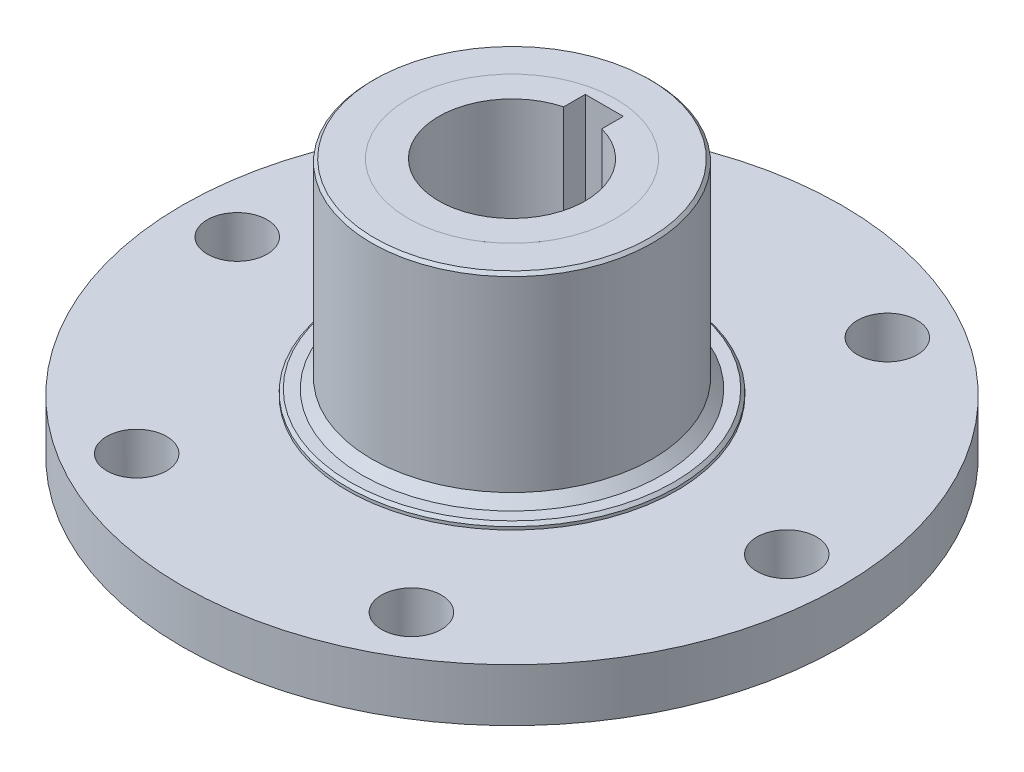
ISO-10303-21;
HEADER;
FILE_DESCRIPTION(('STEP AP214'),'2;1');
FILE_NAME('part.step','',(''),(''),'','','');
FILE_SCHEMA(('AUTOMOTIVE_DESIGN { 1 0 10303 214 1 1 1 1 }'));
ENDSEC;
DATA;
#1=APPLICATION_CONTEXT('core data for automotive mechanical design processes');
#2=APPLICATION_PROTOCOL_DEFINITION('international standard','automotive_design',2000,#1);
#3=PRODUCT_CONTEXT('',#1,'mechanical');
#4=PRODUCT('Part','Part','',(#3));
#5=PRODUCT_RELATED_PRODUCT_CATEGORY('part','',(#4));
#6=PRODUCT_DEFINITION_FORMATION('','',#4);
#7=PRODUCT_DEFINITION_CONTEXT('part definition',#1,'design');
#8=PRODUCT_DEFINITION('design','',#6,#7);
#9=PRODUCT_DEFINITION_SHAPE('','',#8);
#10=(LENGTH_UNIT() NAMED_UNIT(*) SI_UNIT(.MILLI.,.METRE.));
#11=(NAMED_UNIT(*) PLANE_ANGLE_UNIT() SI_UNIT($,.RADIAN.));
#12=(NAMED_UNIT(*) SI_UNIT($,.STERADIAN.) SOLID_ANGLE_UNIT());
#13=UNCERTAINTY_MEASURE_WITH_UNIT(LENGTH_MEASURE(1.E-05),#10,'distance_accuracy_value','');
#14=(GEOMETRIC_REPRESENTATION_CONTEXT(3) GLOBAL_UNCERTAINTY_ASSIGNED_CONTEXT((#13)) GLOBAL_UNIT_ASSIGNED_CONTEXT((#10,
#11,#12)) REPRESENTATION_CONTEXT('',''));
#15=CARTESIAN_POINT('',(0.,0.,0.));
#16=DIRECTION('',(0.,0.,1.));
#17=DIRECTION('',(1.,0.,0.));
#18=AXIS2_PLACEMENT_3D('',#15,#16,#17);
#19=CARTESIAN_POINT('',(0.,0.,0.));
#20=DIRECTION('',(0.,1.,0.));
#21=DIRECTION('',(0.,0.,1.));
#22=AXIS2_PLACEMENT_3D('',#19,#20,#21);
#23=PLANE('',#22);
#24=CARTESIAN_POINT('',(0.,0.,0.));
#25=DIRECTION('',(0.,1.,0.));
#26=DIRECTION('',(0.,0.,1.));
#27=AXIS2_PLACEMENT_3D('',#24,#25,#26);
#28=CIRCLE('',#27,8.98423544024529);
#29=CARTESIAN_POINT('',(0.,0.,8.98423544024529));
#30=VERTEX_POINT('',#29);
#31=EDGE_CURVE('E159',#30,#30,#28,.T.);
#32=ORIENTED_EDGE('',*,*,#31,.F.);
#33=EDGE_LOOP('',(#32));
#34=FACE_BOUND('',#33,.T.);
#35=DIRECTION('',(-1.,0.,0.));
#36=VECTOR('',#35,1.);
#37=CARTESIAN_POINT('',(1.651,0.,-8.001));
#38=LINE('',#37,#36);
#39=CARTESIAN_POINT('',(1.651,0.,-8.001));
#40=VERTEX_POINT('',#39);
#41=CARTESIAN_POINT('',(-1.651,0.,-8.001));
#42=VERTEX_POINT('',#41);
#43=EDGE_CURVE('E91',#40,#42,#38,.T.);
#44=ORIENTED_EDGE('',*,*,#43,.T.);
#45=DIRECTION('',(0.,0.,1.));
#46=VECTOR('',#45,1.);
#47=CARTESIAN_POINT('',(-1.651,0.,-8.001));
#48=LINE('',#47,#46);
#49=CARTESIAN_POINT('',(-1.651,0.,-6.13161471392324));
#50=VERTEX_POINT('',#49);
#51=EDGE_CURVE('E94',#42,#50,#48,.T.);
#52=ORIENTED_EDGE('',*,*,#51,.T.);
#53=CARTESIAN_POINT('',(0.,0.,0.));
#54=DIRECTION('',(0.,-1.,0.));
#55=DIRECTION('',(0.,0.,-1.));
#56=AXIS2_PLACEMENT_3D('',#53,#54,#55);
#57=CIRCLE('',#56,6.35);
#58=CARTESIAN_POINT('',(1.651,0.,-6.13161471392324));
#59=VERTEX_POINT('',#58);
#60=EDGE_CURVE('E96',#59,#50,#57,.T.);
#61=ORIENTED_EDGE('',*,*,#60,.F.);
#62=DIRECTION('',(0.,0.,-1.));
#63=VECTOR('',#62,1.);
#64=CARTESIAN_POINT('',(1.651,0.,-6.13161471392324));
#65=LINE('',#64,#63);
#66=EDGE_CURVE('E83',#59,#40,#65,.T.);
#67=ORIENTED_EDGE('',*,*,#66,.T.);
#68=EDGE_LOOP('',(#44,#52,#61,#67));
#69=FACE_BOUND('',#68,.T.);
#70=ADVANCED_FACE('F36',(#34,#69),#23,.F.);
#71=CARTESIAN_POINT('',(0.,0.254000000000011,0.));
#72=DIRECTION('',(0.,1.,0.));
#73=DIRECTION('',(0.,0.,1.));
#74=AXIS2_PLACEMENT_3D('',#71,#72,#73);
#75=CONICAL_SURFACE('',#74,9.2382354402453,0.785398163397459);
#76=CARTESIAN_POINT('',(0.,0.254000000000011,0.));
#77=DIRECTION('',(0.,1.,0.));
#78=DIRECTION('',(0.,0.,1.));
#79=AXIS2_PLACEMENT_3D('',#76,#77,#78);
#80=CIRCLE('',#79,9.2382354402453);
#81=CARTESIAN_POINT('',(0.,0.254000000000011,9.2382354402453));
#82=VERTEX_POINT('',#81);
#83=EDGE_CURVE('E155',#82,#82,#80,.T.);
#84=ORIENTED_EDGE('',*,*,#83,.F.);
#85=EDGE_LOOP('',(#84));
#86=FACE_BOUND('',#85,.T.);
#87=ORIENTED_EDGE('',*,*,#31,.T.);
#88=EDGE_LOOP('',(#87));
#89=FACE_BOUND('',#88,.T.);
#90=ADVANCED_FACE('F305',(#86,#89),#75,.T.);
#91=CARTESIAN_POINT('',(0.,-26.1296757039814,0.));
#92=DIRECTION('',(0.,1.,0.));
#93=DIRECTION('',(0.,0.,1.));
#94=AXIS2_PLACEMENT_3D('',#91,#92,#93);
#95=CYLINDRICAL_SURFACE('',#94,9.2382354402453);
#96=CARTESIAN_POINT('',(0.,1.524,0.));
#97=DIRECTION('',(0.,1.,0.));
#98=DIRECTION('',(0.,0.,1.));
#99=AXIS2_PLACEMENT_3D('',#96,#97,#98);
#100=CIRCLE('',#99,9.2382354402453);
#101=CARTESIAN_POINT('',(0.,1.524,9.2382354402453));
#102=VERTEX_POINT('',#101);
#103=EDGE_CURVE('E154',#102,#102,#100,.T.);
#104=ORIENTED_EDGE('',*,*,#103,.F.);
#105=EDGE_LOOP('',(#104));
#106=FACE_BOUND('',#105,.T.);
#107=ORIENTED_EDGE('',*,*,#83,.T.);
#108=EDGE_LOOP('',(#107));
#109=FACE_BOUND('',#108,.T.);
#110=ADVANCED_FACE('F298',(#106,#109),#95,.T.);
#111=CARTESIAN_POINT('',(-8.89,1.524,0.));
#112=DIRECTION('',(0.,-1.,0.));
#113=DIRECTION('',(0.,0.,-1.));
#114=AXIS2_PLACEMENT_3D('',#111,#112,#113);
#115=PLANE('',#114);
#116=CARTESIAN_POINT('',(0.,1.524,0.));
#117=DIRECTION('',(0.,1.,0.));
#118=DIRECTION('',(0.,0.,1.));
#119=AXIS2_PLACEMENT_3D('',#116,#117,#118);
#120=CIRCLE('',#119,14.0208);
#121=CARTESIAN_POINT('',(0.,1.524,14.0208));
#122=VERTEX_POINT('',#121);
#123=EDGE_CURVE('E150',#122,#122,#120,.T.);
#124=ORIENTED_EDGE('',*,*,#123,.F.);
#125=EDGE_LOOP('',(#124));
#126=FACE_BOUND('',#125,.T.);
#127=ORIENTED_EDGE('',*,*,#103,.T.);
#128=EDGE_LOOP('',(#127));
#129=FACE_BOUND('',#128,.T.);
#130=ADVANCED_FACE('F290',(#126,#129),#115,.T.);
#131=CARTESIAN_POINT('',(0.,1.77800000000001,0.));
#132=DIRECTION('',(0.,1.,0.));
#133=DIRECTION('',(0.,0.,1.));
#134=AXIS2_PLACEMENT_3D('',#131,#132,#133);
#135=CONICAL_SURFACE('',#134,14.2748,0.785398163397456);
#136=ORIENTED_EDGE('',*,*,#123,.T.);
#137=EDGE_LOOP('',(#136));
#138=FACE_BOUND('',#137,.T.);
#139=CARTESIAN_POINT('',(0.,1.77800000000001,0.));
#140=DIRECTION('',(0.,-1.,0.));
#141=DIRECTION('',(0.,0.,-1.));
#142=AXIS2_PLACEMENT_3D('',#139,#140,#141);
#143=CIRCLE('',#142,14.2748);
#144=CARTESIAN_POINT('',(0.,1.77800000000001,-14.2748));
#145=VERTEX_POINT('',#144);
#146=EDGE_CURVE('E143',#145,#145,#143,.F.);
#147=ORIENTED_EDGE('',*,*,#146,.F.);
#148=EDGE_LOOP('',(#147));
#149=FACE_BOUND('',#148,.T.);
#150=ADVANCED_FACE('F236',(#138,#149),#135,.T.);
#151=CARTESIAN_POINT('',(0.,-1.0757851457721,0.));
#152=DIRECTION('',(0.,-1.,0.));
#153=DIRECTION('',(0.,0.,-1.));
#154=AXIS2_PLACEMENT_3D('',#151,#152,#153);
#155=CYLINDRICAL_SURFACE('',#154,14.2748);
#156=CARTESIAN_POINT('',(0.,3.048,0.));
#157=DIRECTION('',(0.,-1.,0.));
#158=DIRECTION('',(0.,0.,-1.));
#159=AXIS2_PLACEMENT_3D('',#156,#157,#158);
#160=CIRCLE('',#159,14.2748);
#161=CARTESIAN_POINT('',(0.,3.048,-14.2748));
#162=VERTEX_POINT('',#161);
#163=EDGE_CURVE('E180',#162,#162,#160,.F.);
#164=ORIENTED_EDGE('',*,*,#163,.F.);
#165=EDGE_LOOP('',(#164));
#166=FACE_BOUND('',#165,.T.);
#167=ORIENTED_EDGE('',*,*,#146,.T.);
#168=EDGE_LOOP('',(#167));
#169=FACE_BOUND('',#168,.T.);
#170=ADVANCED_FACE('F226',(#166,#169),#155,.T.);
#171=CARTESIAN_POINT('',(-38.1,3.048,0.));
#172=DIRECTION('',(0.,-1.,0.));
#173=DIRECTION('',(0.,0.,-1.));
#174=AXIS2_PLACEMENT_3D('',#171,#172,#173);
#175=PLANE('',#174);
#176=CARTESIAN_POINT('',(-11.9062499999998,3.048,20.6222299276171));
#177=DIRECTION('',(0.,1.,0.));
#178=DIRECTION('',(0.,0.,1.));
#179=AXIS2_PLACEMENT_3D('',#176,#177,#178);
#180=CIRCLE('',#179,2.5908);
#181=CARTESIAN_POINT('',(-11.9062499999998,3.048,23.2130299276171));
#182=VERTEX_POINT('',#181);
#183=EDGE_CURVE('E174',#182,#182,#180,.T.);
#184=ORIENTED_EDGE('',*,*,#183,.T.);
#185=EDGE_LOOP('',(#184));
#186=FACE_BOUND('',#185,.T.);
#187=CARTESIAN_POINT('',(11.9062500000002,3.048,20.6222299276168));
#188=DIRECTION('',(0.,1.,0.));
#189=DIRECTION('',(0.,0.,1.));
#190=AXIS2_PLACEMENT_3D('',#187,#188,#189);
#191=CIRCLE('',#190,2.5908);
#192=CARTESIAN_POINT('',(11.9062500000002,3.048,23.2130299276168));
#193=VERTEX_POINT('',#192);
#194=EDGE_CURVE('E171',#193,#193,#191,.T.);
#195=ORIENTED_EDGE('',*,*,#194,.T.);
#196=EDGE_LOOP('',(#195));
#197=FACE_BOUND('',#196,.T.);
#198=CARTESIAN_POINT('',(23.8125,3.048,0.));
#199=DIRECTION('',(0.,1.,0.));
#200=DIRECTION('',(0.,0.,1.));
#201=AXIS2_PLACEMENT_3D('',#198,#199,#200);
#202=CIRCLE('',#201,2.5908);
#203=CARTESIAN_POINT('',(23.8125,3.048,2.5908));
#204=VERTEX_POINT('',#203);
#205=EDGE_CURVE('E168',#204,#204,#202,.T.);
#206=ORIENTED_EDGE('',*,*,#205,.T.);
#207=EDGE_LOOP('',(#206));
#208=FACE_BOUND('',#207,.T.);
#209=CARTESIAN_POINT('',(11.90625,3.048,-20.622229927617));
#210=DIRECTION('',(0.,1.,0.));
#211=DIRECTION('',(0.,0.,1.));
#212=AXIS2_PLACEMENT_3D('',#209,#210,#211);
#213=CIRCLE('',#212,2.5908);
#214=CARTESIAN_POINT('',(11.90625,3.048,-18.031429927617));
#215=VERTEX_POINT('',#214);
#216=EDGE_CURVE('E165',#215,#215,#213,.T.);
#217=ORIENTED_EDGE('',*,*,#216,.T.);
#218=EDGE_LOOP('',(#217));
#219=FACE_BOUND('',#218,.T.);
#220=CARTESIAN_POINT('',(-11.9062500000001,3.048,-20.6222299276169));
#221=DIRECTION('',(0.,1.,0.));
#222=DIRECTION('',(0.,0.,1.));
#223=AXIS2_PLACEMENT_3D('',#220,#221,#222);
#224=CIRCLE('',#223,2.5908);
#225=CARTESIAN_POINT('',(-11.9062500000001,3.048,-18.0314299276169));
#226=VERTEX_POINT('',#225);
#227=EDGE_CURVE('E162',#226,#226,#224,.T.);
#228=ORIENTED_EDGE('',*,*,#227,.T.);
#229=EDGE_LOOP('',(#228));
#230=FACE_BOUND('',#229,.T.);
#231=CARTESIAN_POINT('',(-23.8125,3.048,0.));
#232=DIRECTION('',(0.,1.,0.));
#233=DIRECTION('',(0.,0.,1.));
#234=AXIS2_PLACEMENT_3D('',#231,#232,#233);
#235=CIRCLE('',#234,2.5908);
#236=CARTESIAN_POINT('',(-23.8125,3.048,2.5908));
#237=VERTEX_POINT('',#236);
#238=EDGE_CURVE('E142',#237,#237,#235,.T.);
#239=ORIENTED_EDGE('',*,*,#238,.T.);
#240=EDGE_LOOP('',(#239));
#241=FACE_BOUND('',#240,.T.);
#242=ORIENTED_EDGE('',*,*,#163,.T.);
#243=EDGE_LOOP('',(#242));
#244=FACE_BOUND('',#243,.T.);
#245=CARTESIAN_POINT('',(0.,3.048,0.));
#246=DIRECTION('',(0.,-1.,0.));
#247=DIRECTION('',(0.,0.,-1.));
#248=AXIS2_PLACEMENT_3D('',#245,#246,#247);
#249=CIRCLE('',#248,28.575);
#250=CARTESIAN_POINT('',(0.,3.048,-28.575));
#251=VERTEX_POINT('',#250);
#252=EDGE_CURVE('E133',#251,#251,#249,.T.);
#253=ORIENTED_EDGE('',*,*,#252,.T.);
#254=EDGE_LOOP('',(#253));
#255=FACE_BOUND('',#254,.T.);
#256=ADVANCED_FACE('F223',(#186,#197,#208,#219,#230,#241,#244,#255),#175,.T.);
#257=CARTESIAN_POINT('',(-11.9062499999998,0.,20.6222299276171));
#258=DIRECTION('',(0.,1.,0.));
#259=DIRECTION('',(0.,0.,1.));
#260=AXIS2_PLACEMENT_3D('',#257,#258,#259);
#261=CYLINDRICAL_SURFACE('',#260,2.5908);
#262=ORIENTED_EDGE('',*,*,#183,.F.);
#263=EDGE_LOOP('',(#262));
#264=FACE_BOUND('',#263,.T.);
#265=CARTESIAN_POINT('',(-11.9062499999998,7.62,20.6222299276171));
#266=DIRECTION('',(0.,-1.,0.));
#267=DIRECTION('',(0.,0.,-1.));
#268=AXIS2_PLACEMENT_3D('',#265,#266,#267);
#269=CIRCLE('',#268,2.5908);
#270=CARTESIAN_POINT('',(-11.9062499999998,7.62,18.0314299276171));
#271=VERTEX_POINT('',#270);
#272=EDGE_CURVE('E130',#271,#271,#269,.T.);
#273=ORIENTED_EDGE('',*,*,#272,.F.);
#274=EDGE_LOOP('',(#273));
#275=FACE_BOUND('',#274,.T.);
#276=ADVANCED_FACE('F225',(#264,#275),#261,.F.);
#277=CARTESIAN_POINT('',(11.9062500000002,0.,20.6222299276168));
#278=DIRECTION('',(0.,1.,0.));
#279=DIRECTION('',(0.,0.,1.));
#280=AXIS2_PLACEMENT_3D('',#277,#278,#279);
#281=CYLINDRICAL_SURFACE('',#280,2.5908);
#282=ORIENTED_EDGE('',*,*,#194,.F.);
#283=EDGE_LOOP('',(#282));
#284=FACE_BOUND('',#283,.T.);
#285=CARTESIAN_POINT('',(11.9062500000002,7.62,20.6222299276168));
#286=DIRECTION('',(0.,-1.,0.));
#287=DIRECTION('',(0.,0.,-1.));
#288=AXIS2_PLACEMENT_3D('',#285,#286,#287);
#289=CIRCLE('',#288,2.5908);
#290=CARTESIAN_POINT('',(11.9062500000002,7.62,18.0314299276168));
#291=VERTEX_POINT('',#290);
#292=EDGE_CURVE('E127',#291,#291,#289,.T.);
#293=ORIENTED_EDGE('',*,*,#292,.F.);
#294=EDGE_LOOP('',(#293));
#295=FACE_BOUND('',#294,.T.);
#296=ADVANCED_FACE('F233',(#284,#295),#281,.F.);
#297=CARTESIAN_POINT('',(23.8125,0.,0.));
#298=DIRECTION('',(0.,1.,0.));
#299=DIRECTION('',(0.,0.,1.));
#300=AXIS2_PLACEMENT_3D('',#297,#298,#299);
#301=CYLINDRICAL_SURFACE('',#300,2.5908);
#302=ORIENTED_EDGE('',*,*,#205,.F.);
#303=EDGE_LOOP('',(#302));
#304=FACE_BOUND('',#303,.T.);
#305=CARTESIAN_POINT('',(23.8125,7.62,0.));
#306=DIRECTION('',(0.,-1.,0.));
#307=DIRECTION('',(0.,0.,-1.));
#308=AXIS2_PLACEMENT_3D('',#305,#306,#307);
#309=CIRCLE('',#308,2.5908);
#310=CARTESIAN_POINT('',(23.8125,7.62,-2.5908));
#311=VERTEX_POINT('',#310);
#312=EDGE_CURVE('E124',#311,#311,#309,.T.);
#313=ORIENTED_EDGE('',*,*,#312,.F.);
#314=EDGE_LOOP('',(#313));
#315=FACE_BOUND('',#314,.T.);
#316=ADVANCED_FACE('F258',(#304,#315),#301,.F.);
#317=CARTESIAN_POINT('',(11.90625,0.,-20.622229927617));
#318=DIRECTION('',(0.,1.,0.));
#319=DIRECTION('',(0.,0.,1.));
#320=AXIS2_PLACEMENT_3D('',#317,#318,#319);
#321=CYLINDRICAL_SURFACE('',#320,2.5908);
#322=ORIENTED_EDGE('',*,*,#216,.F.);
#323=EDGE_LOOP('',(#322));
#324=FACE_BOUND('',#323,.T.);
#325=CARTESIAN_POINT('',(11.90625,7.62,-20.622229927617));
#326=DIRECTION('',(0.,-1.,0.));
#327=DIRECTION('',(0.,0.,-1.));
#328=AXIS2_PLACEMENT_3D('',#325,#326,#327);
#329=CIRCLE('',#328,2.5908);
#330=CARTESIAN_POINT('',(11.90625,7.62,-23.213029927617));
#331=VERTEX_POINT('',#330);
#332=EDGE_CURVE('E121',#331,#331,#329,.T.);
#333=ORIENTED_EDGE('',*,*,#332,.F.);
#334=EDGE_LOOP('',(#333));
#335=FACE_BOUND('',#334,.T.);
#336=ADVANCED_FACE('F249',(#324,#335),#321,.F.);
#337=CARTESIAN_POINT('',(-11.9062500000001,0.,-20.6222299276169));
#338=DIRECTION('',(0.,1.,0.));
#339=DIRECTION('',(0.,0.,1.));
#340=AXIS2_PLACEMENT_3D('',#337,#338,#339);
#341=CYLINDRICAL_SURFACE('',#340,2.5908);
#342=ORIENTED_EDGE('',*,*,#227,.F.);
#343=EDGE_LOOP('',(#342));
#344=FACE_BOUND('',#343,.T.);
#345=CARTESIAN_POINT('',(-11.90625,7.62,-20.622229927617));
#346=DIRECTION('',(0.,-1.,0.));
#347=DIRECTION('',(0.,0.,-1.));
#348=AXIS2_PLACEMENT_3D('',#345,#346,#347);
#349=CIRCLE('',#348,2.59079999999991);
#350=CARTESIAN_POINT('',(-11.90625,7.62,-23.2130299276169));
#351=VERTEX_POINT('',#350);
#352=EDGE_CURVE('E118',#351,#351,#349,.T.);
#353=ORIENTED_EDGE('',*,*,#352,.F.);
#354=EDGE_LOOP('',(#353));
#355=FACE_BOUND('',#354,.T.);
#356=ADVANCED_FACE('F243',(#344,#355),#341,.F.);
#357=CARTESIAN_POINT('',(-23.8125,0.,0.));
#358=DIRECTION('',(0.,1.,0.));
#359=DIRECTION('',(0.,0.,1.));
#360=AXIS2_PLACEMENT_3D('',#357,#358,#359);
#361=CYLINDRICAL_SURFACE('',#360,2.5908);
#362=ORIENTED_EDGE('',*,*,#238,.F.);
#363=EDGE_LOOP('',(#362));
#364=FACE_BOUND('',#363,.T.);
#365=CARTESIAN_POINT('',(-23.8125,7.62,0.));
#366=DIRECTION('',(0.,-1.,0.));
#367=DIRECTION('',(0.,0.,-1.));
#368=AXIS2_PLACEMENT_3D('',#365,#366,#367);
#369=CIRCLE('',#368,2.59080000000001);
#370=CARTESIAN_POINT('',(-23.8125,7.62,-2.59080000000001));
#371=VERTEX_POINT('',#370);
#372=EDGE_CURVE('E115',#371,#371,#369,.T.);
#373=ORIENTED_EDGE('',*,*,#372,.F.);
#374=EDGE_LOOP('',(#373));
#375=FACE_BOUND('',#374,.T.);
#376=ADVANCED_FACE('F201',(#364,#375),#361,.F.);
#377=CARTESIAN_POINT('',(0.,7.62,0.));
#378=DIRECTION('',(0.,-1.,0.));
#379=DIRECTION('',(0.,0.,-1.));
#380=AXIS2_PLACEMENT_3D('',#377,#378,#379);
#381=PLANE('',#380);
#382=CARTESIAN_POINT('',(0.,7.62,0.));
#383=DIRECTION('',(0.,-1.,0.));
#384=DIRECTION('',(0.,0.,-1.));
#385=AXIS2_PLACEMENT_3D('',#382,#383,#384);
#386=CIRCLE('',#385,14.2748);
#387=CARTESIAN_POINT('',(0.,7.62,-14.2748));
#388=VERTEX_POINT('',#387);
#389=EDGE_CURVE('E137',#388,#388,#386,.F.);
#390=ORIENTED_EDGE('',*,*,#389,.F.);
#391=EDGE_LOOP('',(#390));
#392=FACE_BOUND('',#391,.T.);
#393=ORIENTED_EDGE('',*,*,#372,.T.);
#394=EDGE_LOOP('',(#393));
#395=FACE_BOUND('',#394,.T.);
#396=ORIENTED_EDGE('',*,*,#352,.T.);
#397=EDGE_LOOP('',(#396));
#398=FACE_BOUND('',#397,.T.);
#399=ORIENTED_EDGE('',*,*,#332,.T.);
#400=EDGE_LOOP('',(#399));
#401=FACE_BOUND('',#400,.T.);
#402=ORIENTED_EDGE('',*,*,#312,.T.);
#403=EDGE_LOOP('',(#402));
#404=FACE_BOUND('',#403,.T.);
#405=ORIENTED_EDGE('',*,*,#292,.T.);
#406=EDGE_LOOP('',(#405));
#407=FACE_BOUND('',#406,.T.);
#408=ORIENTED_EDGE('',*,*,#272,.T.);
#409=EDGE_LOOP('',(#408));
#410=FACE_BOUND('',#409,.T.);
#411=CARTESIAN_POINT('',(0.,7.62,0.));
#412=DIRECTION('',(0.,-1.,0.));
#413=DIRECTION('',(0.,0.,-1.));
#414=AXIS2_PLACEMENT_3D('',#411,#412,#413);
#415=CIRCLE('',#414,28.575);
#416=CARTESIAN_POINT('',(0.,7.62,-28.575));
#417=VERTEX_POINT('',#416);
#418=EDGE_CURVE('E134',#417,#417,#415,.T.);
#419=ORIENTED_EDGE('',*,*,#418,.F.);
#420=EDGE_LOOP('',(#419));
#421=FACE_BOUND('',#420,.T.);
#422=ADVANCED_FACE('F197',(#392,#395,#398,#401,#404,#407,#410,#421),#381,.F.);
#423=CARTESIAN_POINT('',(0.,7.62,0.));
#424=DIRECTION('',(0.,-1.,0.));
#425=DIRECTION('',(0.,0.,-1.));
#426=AXIS2_PLACEMENT_3D('',#423,#424,#425);
#427=CYLINDRICAL_SURFACE('',#426,28.575);
#428=ORIENTED_EDGE('',*,*,#418,.T.);
#429=EDGE_LOOP('',(#428));
#430=FACE_BOUND('',#429,.T.);
#431=ORIENTED_EDGE('',*,*,#252,.F.);
#432=EDGE_LOOP('',(#431));
#433=FACE_BOUND('',#432,.T.);
#434=ADVANCED_FACE('F200',(#430,#433),#427,.T.);
#435=CARTESIAN_POINT('',(0.,25.146,0.));
#436=DIRECTION('',(0.,-1.,0.));
#437=DIRECTION('',(1.,0.,0.));
#438=AXIS2_PLACEMENT_3D('',#435,#436,#437);
#439=CONICAL_SURFACE('',#438,12.1666,0.785398163397452);
#440=CARTESIAN_POINT('',(0.,25.4,0.));
#441=DIRECTION('',(0.,-1.,0.));
#442=DIRECTION('',(1.,0.,0.));
#443=AXIS2_PLACEMENT_3D('',#440,#441,#442);
#444=CIRCLE('',#443,11.9126);
#445=CARTESIAN_POINT('',(11.9126,25.4,0.));
#446=VERTEX_POINT('',#445);
#447=EDGE_CURVE('E158',#446,#446,#444,.T.);
#448=ORIENTED_EDGE('',*,*,#447,.T.);
#449=EDGE_LOOP('',(#448));
#450=FACE_BOUND('',#449,.T.);
#451=CARTESIAN_POINT('',(0.,25.146,0.));
#452=DIRECTION('',(0.,-1.,0.));
#453=DIRECTION('',(0.,0.,-1.));
#454=AXIS2_PLACEMENT_3D('',#451,#452,#453);
#455=CIRCLE('',#454,12.1666);
#456=CARTESIAN_POINT('',(0.,25.146,-12.1666));
#457=VERTEX_POINT('',#456);
#458=EDGE_CURVE('E151',#457,#457,#455,.T.);
#459=ORIENTED_EDGE('',*,*,#458,.F.);
#460=EDGE_LOOP('',(#459));
#461=FACE_BOUND('',#460,.T.);
#462=ADVANCED_FACE('F219',(#450,#461),#439,.T.);
#463=CARTESIAN_POINT('',(0.,25.4,0.));
#464=DIRECTION('',(0.,1.,0.));
#465=DIRECTION('',(0.,0.,1.));
#466=AXIS2_PLACEMENT_3D('',#463,#464,#465);
#467=PLANE('',#466);
#468=CARTESIAN_POINT('',(0.,25.4,0.));
#469=DIRECTION('',(0.,1.,0.));
#470=DIRECTION('',(0.,0.,1.));
#471=AXIS2_PLACEMENT_3D('',#468,#469,#470);
#472=CIRCLE('',#471,8.98423544024529);
#473=CARTESIAN_POINT('',(0.,25.4,8.98423544024529));
#474=VERTEX_POINT('',#473);
#475=EDGE_CURVE('E11',#474,#474,#472,.T.);
#476=ORIENTED_EDGE('',*,*,#475,.F.);
#477=EDGE_LOOP('',(#476));
#478=FACE_BOUND('',#477,.T.);
#479=ORIENTED_EDGE('',*,*,#447,.F.);
#480=EDGE_LOOP('',(#479));
#481=FACE_BOUND('',#480,.T.);
#482=ADVANCED_FACE('F294',(#478,#481),#467,.T.);
#483=CARTESIAN_POINT('',(0.,25.4,0.));
#484=DIRECTION('',(0.,-1.,0.));
#485=DIRECTION('',(0.,0.,-1.));
#486=AXIS2_PLACEMENT_3D('',#483,#484,#485);
#487=CYLINDRICAL_SURFACE('',#486,12.1666);
#488=ORIENTED_EDGE('',*,*,#458,.T.);
#489=EDGE_LOOP('',(#488));
#490=FACE_BOUND('',#489,.T.);
#491=CARTESIAN_POINT('',(0.,8.94079999999999,0.));
#492=DIRECTION('',(0.,-1.,0.));
#493=DIRECTION('',(0.,0.,-1.));
#494=AXIS2_PLACEMENT_3D('',#491,#492,#493);
#495=CIRCLE('',#494,12.1666);
#496=CARTESIAN_POINT('',(0.,8.94079999999999,-12.1666));
#497=VERTEX_POINT('',#496);
#498=EDGE_CURVE('E147',#497,#497,#495,.T.);
#499=ORIENTED_EDGE('',*,*,#498,.F.);
#500=EDGE_LOOP('',(#499));
#501=FACE_BOUND('',#500,.T.);
#502=ADVANCED_FACE('F284',(#490,#501),#487,.T.);
#503=CARTESIAN_POINT('',(0.,8.128,0.));
#504=DIRECTION('',(0.,-1.,0.));
#505=DIRECTION('',(0.,0.,-1.));
#506=AXIS2_PLACEMENT_3D('',#503,#504,#505);
#507=CONICAL_SURFACE('',#506,12.9794,0.785398163397449);
#508=ORIENTED_EDGE('',*,*,#498,.T.);
#509=EDGE_LOOP('',(#508));
#510=FACE_BOUND('',#509,.T.);
#511=CARTESIAN_POINT('',(0.,8.128,0.));
#512=DIRECTION('',(0.,-1.,0.));
#513=DIRECTION('',(0.,0.,-1.));
#514=AXIS2_PLACEMENT_3D('',#511,#512,#513);
#515=CIRCLE('',#514,12.9794);
#516=CARTESIAN_POINT('',(0.,8.128,-12.9794));
#517=VERTEX_POINT('',#516);
#518=EDGE_CURVE('E146',#517,#517,#515,.T.);
#519=ORIENTED_EDGE('',*,*,#518,.F.);
#520=EDGE_LOOP('',(#519));
#521=FACE_BOUND('',#520,.T.);
#522=ADVANCED_FACE('F275',(#510,#521),#507,.T.);
#523=CARTESIAN_POINT('',(0.,8.128,0.));
#524=DIRECTION('',(0.,1.,0.));
#525=DIRECTION('',(0.,0.,1.));
#526=AXIS2_PLACEMENT_3D('',#523,#524,#525);
#527=PLANE('',#526);
#528=ORIENTED_EDGE('',*,*,#518,.T.);
#529=EDGE_LOOP('',(#528));
#530=FACE_BOUND('',#529,.T.);
#531=CARTESIAN_POINT('',(0.,8.128,0.));
#532=DIRECTION('',(0.,-1.,0.));
#533=DIRECTION('',(1.,0.,0.));
#534=AXIS2_PLACEMENT_3D('',#531,#532,#533);
#535=CIRCLE('',#534,14.0208);
#536=CARTESIAN_POINT('',(14.0208,8.128,0.));
#537=VERTEX_POINT('',#536);
#538=EDGE_CURVE('E177',#537,#537,#535,.T.);
#539=ORIENTED_EDGE('',*,*,#538,.F.);
#540=EDGE_LOOP('',(#539));
#541=FACE_BOUND('',#540,.T.);
#542=ADVANCED_FACE('F267',(#530,#541),#527,.T.);
#543=CARTESIAN_POINT('',(0.,7.87399999999998,0.));
#544=DIRECTION('',(0.,-1.,0.));
#545=DIRECTION('',(1.,0.,0.));
#546=AXIS2_PLACEMENT_3D('',#543,#544,#545);
#547=CONICAL_SURFACE('',#546,14.2748,0.785398163397455);
#548=ORIENTED_EDGE('',*,*,#538,.T.);
#549=EDGE_LOOP('',(#548));
#550=FACE_BOUND('',#549,.T.);
#551=CARTESIAN_POINT('',(0.,7.87399999999998,0.));
#552=DIRECTION('',(0.,-1.,0.));
#553=DIRECTION('',(0.,0.,-1.));
#554=AXIS2_PLACEMENT_3D('',#551,#552,#553);
#555=CIRCLE('',#554,14.2748);
#556=CARTESIAN_POINT('',(0.,7.87399999999998,-14.2748));
#557=VERTEX_POINT('',#556);
#558=EDGE_CURVE('E44',#557,#557,#555,.T.);
#559=ORIENTED_EDGE('',*,*,#558,.F.);
#560=EDGE_LOOP('',(#559));
#561=FACE_BOUND('',#560,.T.);
#562=ADVANCED_FACE('F265',(#550,#561),#547,.T.);
#563=CARTESIAN_POINT('',(0.,-1.0757851457721,0.));
#564=DIRECTION('',(0.,-1.,0.));
#565=DIRECTION('',(0.,0.,-1.));
#566=AXIS2_PLACEMENT_3D('',#563,#564,#565);
#567=CYLINDRICAL_SURFACE('',#566,14.2748);
#568=ORIENTED_EDGE('',*,*,#558,.T.);
#569=EDGE_LOOP('',(#568));
#570=FACE_BOUND('',#569,.T.);
#571=ORIENTED_EDGE('',*,*,#389,.T.);
#572=EDGE_LOOP('',(#571));
#573=FACE_BOUND('',#572,.T.);
#574=ADVANCED_FACE('F195',(#570,#573),#567,.T.);
#575=CARTESIAN_POINT('',(0.,25.4001030776407,0.));
#576=DIRECTION('',(0.,-1.,0.));
#577=DIRECTION('',(0.,0.,-1.));
#578=AXIS2_PLACEMENT_3D('',#575,#576,#577);
#579=PLANE('',#578);
#580=CARTESIAN_POINT('',(0.,25.4001030776407,0.));
#581=DIRECTION('',(0.,-1.,0.));
#582=DIRECTION('',(0.,0.,-1.));
#583=AXIS2_PLACEMENT_3D('',#580,#581,#582);
#584=CIRCLE('',#583,6.35);
#585=CARTESIAN_POINT('',(1.651,25.4001030776407,-6.13161471392324));
#586=VERTEX_POINT('',#585);
#587=CARTESIAN_POINT('',(-1.651,25.4001030776407,-6.13161471392324));
#588=VERTEX_POINT('',#587);
#589=EDGE_CURVE('E108',#586,#588,#584,.T.);
#590=ORIENTED_EDGE('',*,*,#589,.T.);
#591=DIRECTION('',(0.,0.,1.));
#592=VECTOR('',#591,1.);
#593=CARTESIAN_POINT('',(-1.651,25.4001030776407,-8.001));
#594=LINE('',#593,#592);
#595=CARTESIAN_POINT('',(-1.651,25.4001030776407,-8.001));
#596=VERTEX_POINT('',#595);
#597=EDGE_CURVE('E97',#596,#588,#594,.T.);
#598=ORIENTED_EDGE('',*,*,#597,.F.);
#599=DIRECTION('',(-1.,0.,0.));
#600=VECTOR('',#599,1.);
#601=CARTESIAN_POINT('',(1.651,25.4001030776407,-8.001));
#602=LINE('',#601,#600);
#603=CARTESIAN_POINT('',(1.651,25.4001030776407,-8.001));
#604=VERTEX_POINT('',#603);
#605=EDGE_CURVE('E99',#604,#596,#602,.T.);
#606=ORIENTED_EDGE('',*,*,#605,.F.);
#607=DIRECTION('',(0.,0.,-1.));
#608=VECTOR('',#607,1.);
#609=CARTESIAN_POINT('',(1.651,25.4001030776407,-6.13161471392324));
#610=LINE('',#609,#608);
#611=EDGE_CURVE('E86',#586,#604,#610,.T.);
#612=ORIENTED_EDGE('',*,*,#611,.F.);
#613=EDGE_LOOP('',(#590,#598,#606,#612));
#614=FACE_BOUND('',#613,.T.);
#615=CARTESIAN_POINT('',(0.,25.4001030776407,0.));
#616=DIRECTION('',(0.,-1.,0.));
#617=DIRECTION('',(0.,0.,-1.));
#618=AXIS2_PLACEMENT_3D('',#615,#616,#617);
#619=CIRCLE('',#618,8.98423544024529);
#620=CARTESIAN_POINT('',(0.,25.4001030776407,-8.98423544024529));
#621=VERTEX_POINT('',#620);
#622=EDGE_CURVE('E111',#621,#621,#619,.T.);
#623=ORIENTED_EDGE('',*,*,#622,.F.);
#624=EDGE_LOOP('',(#623));
#625=FACE_BOUND('',#624,.T.);
#626=ADVANCED_FACE('F273',(#614,#625),#579,.F.);
#627=CARTESIAN_POINT('',(0.,25.4001030776407,0.));
#628=DIRECTION('',(0.,-1.,0.));
#629=DIRECTION('',(0.,0.,-1.));
#630=AXIS2_PLACEMENT_3D('',#627,#628,#629);
#631=CYLINDRICAL_SURFACE('',#630,8.98423544024529);
#632=ORIENTED_EDGE('',*,*,#475,.T.);
#633=EDGE_LOOP('',(#632));
#634=FACE_BOUND('',#633,.T.);
#635=ORIENTED_EDGE('',*,*,#622,.T.);
#636=EDGE_LOOP('',(#635));
#637=FACE_BOUND('',#636,.T.);
#638=ADVANCED_FACE('F330',(#634,#637),#631,.T.);
#639=CARTESIAN_POINT('',(0.,25.4001030776407,0.));
#640=DIRECTION('',(0.,-1.,0.));
#641=DIRECTION('',(0.,0.,-1.));
#642=AXIS2_PLACEMENT_3D('',#639,#640,#641);
#643=CYLINDRICAL_SURFACE('',#642,6.35);
#644=ORIENTED_EDGE('',*,*,#589,.F.);
#645=DIRECTION('',(0.,1.,0.));
#646=VECTOR('',#645,1.);
#647=CARTESIAN_POINT('',(1.651,0.,-6.13161471392324));
#648=LINE('',#647,#646);
#649=EDGE_CURVE('E74',#59,#586,#648,.T.);
#650=ORIENTED_EDGE('',*,*,#649,.F.);
#651=ORIENTED_EDGE('',*,*,#60,.T.);
#652=DIRECTION('',(0.,1.,0.));
#653=VECTOR('',#652,1.);
#654=CARTESIAN_POINT('',(-1.651,0.,-6.13161471392324));
#655=LINE('',#654,#653);
#656=EDGE_CURVE('E52',#50,#588,#655,.T.);
#657=ORIENTED_EDGE('',*,*,#656,.T.);
#658=EDGE_LOOP('',(#644,#650,#651,#657));
#659=FACE_BOUND('',#658,.T.);
#660=ADVANCED_FACE('F343',(#659),#643,.F.);
#661=CARTESIAN_POINT('',(-1.651,0.,-8.001));
#662=DIRECTION('',(-1.,0.,0.));
#663=DIRECTION('',(0.,0.,1.));
#664=AXIS2_PLACEMENT_3D('',#661,#662,#663);
#665=PLANE('',#664);
#666=ORIENTED_EDGE('',*,*,#597,.T.);
#667=ORIENTED_EDGE('',*,*,#656,.F.);
#668=ORIENTED_EDGE('',*,*,#51,.F.);
#669=DIRECTION('',(0.,1.,0.));
#670=VECTOR('',#669,1.);
#671=CARTESIAN_POINT('',(-1.651,0.,-8.001));
#672=LINE('',#671,#670);
#673=EDGE_CURVE('E66',#42,#596,#672,.T.);
#674=ORIENTED_EDGE('',*,*,#673,.T.);
#675=EDGE_LOOP('',(#666,#667,#668,#674));
#676=FACE_BOUND('',#675,.T.);
#677=ADVANCED_FACE('F348',(#676),#665,.F.);
#678=CARTESIAN_POINT('',(1.651,0.,-8.001));
#679=DIRECTION('',(0.,0.,-1.));
#680=DIRECTION('',(-1.,0.,0.));
#681=AXIS2_PLACEMENT_3D('',#678,#679,#680);
#682=PLANE('',#681);
#683=ORIENTED_EDGE('',*,*,#605,.T.);
#684=ORIENTED_EDGE('',*,*,#673,.F.);
#685=ORIENTED_EDGE('',*,*,#43,.F.);
#686=DIRECTION('',(0.,1.,0.));
#687=VECTOR('',#686,1.);
#688=CARTESIAN_POINT('',(1.651,0.,-8.001));
#689=LINE('',#688,#687);
#690=EDGE_CURVE('E79',#40,#604,#689,.T.);
#691=ORIENTED_EDGE('',*,*,#690,.T.);
#692=EDGE_LOOP('',(#683,#684,#685,#691));
#693=FACE_BOUND('',#692,.T.);
#694=ADVANCED_FACE('F92',(#693),#682,.F.);
#695=CARTESIAN_POINT('',(1.651,0.,-6.13161471392324));
#696=DIRECTION('',(1.,0.,0.));
#697=DIRECTION('',(0.,0.,-1.));
#698=AXIS2_PLACEMENT_3D('',#695,#696,#697);
#699=PLANE('',#698);
#700=ORIENTED_EDGE('',*,*,#611,.T.);
#701=ORIENTED_EDGE('',*,*,#690,.F.);
#702=ORIENTED_EDGE('',*,*,#66,.F.);
#703=ORIENTED_EDGE('',*,*,#649,.T.);
#704=EDGE_LOOP('',(#700,#701,#702,#703));
#705=FACE_BOUND('',#704,.T.);
#706=ADVANCED_FACE('F81',(#705),#699,.F.);
#707=CLOSED_SHELL('',(#70,#90,#110,#130,#150,#170,#256,#276,#296,#316,#336,#356,#376,#422,#434,
#462,#482,#502,#522,#542,#562,#574,#626,#638,#660,#677,#694,#706));
#708=MANIFOLD_SOLID_BREP('B2',#707);
#709=ADVANCED_BREP_SHAPE_REPRESENTATION('',(#18,#708),#14);
#710=SHAPE_DEFINITION_REPRESENTATION(#9,#709);
ENDSEC;
END-ISO-10303-21;
